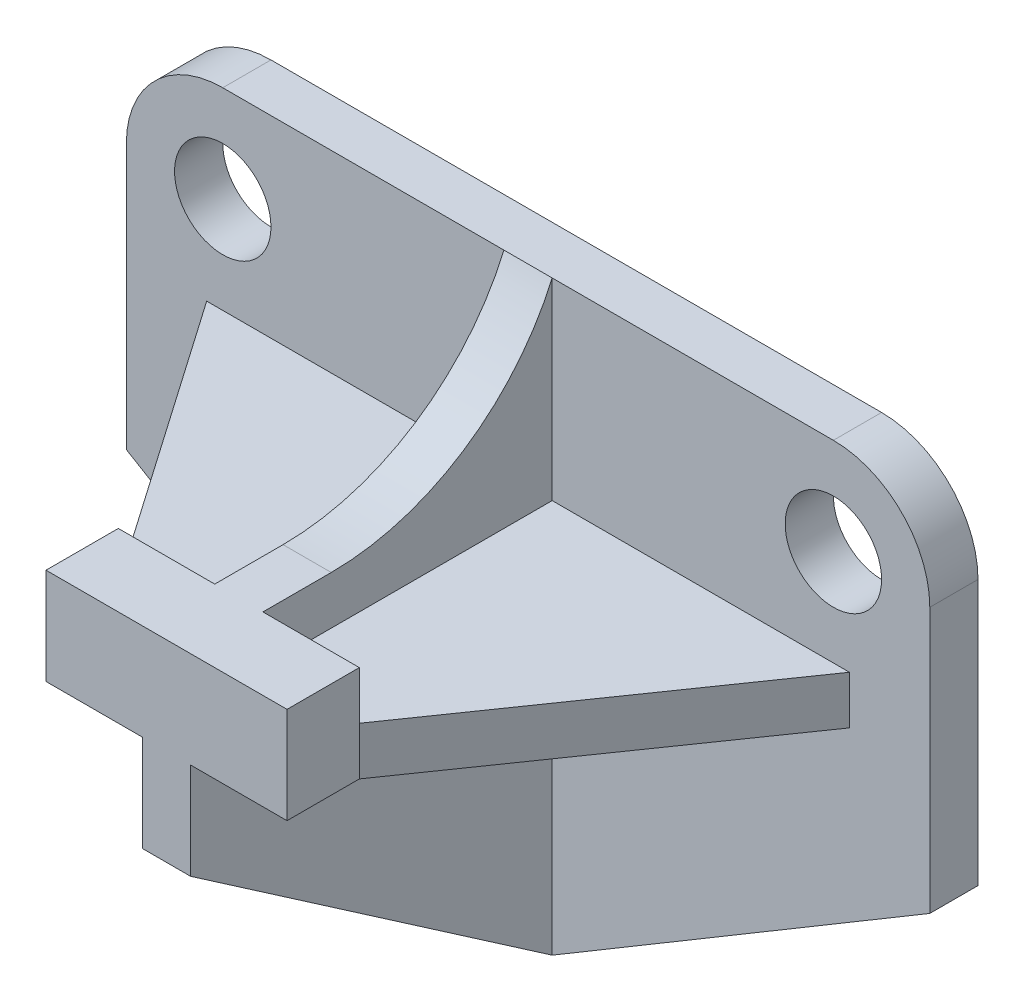
ISO-10303-21;
HEADER;
FILE_DESCRIPTION(('STEP AP214'),'2;1');
FILE_NAME('part.step','',(''),(''),'','','');
FILE_SCHEMA(('AUTOMOTIVE_DESIGN { 1 0 10303 214 1 1 1 1 }'));
ENDSEC;
DATA;
#1=APPLICATION_CONTEXT('core data for automotive mechanical design processes');
#2=APPLICATION_PROTOCOL_DEFINITION('international standard','automotive_design',2000,#1);
#3=PRODUCT_CONTEXT('',#1,'mechanical');
#4=PRODUCT('Part','Part','',(#3));
#5=PRODUCT_RELATED_PRODUCT_CATEGORY('part','',(#4));
#6=PRODUCT_DEFINITION_FORMATION('','',#4);
#7=PRODUCT_DEFINITION_CONTEXT('part definition',#1,'design');
#8=PRODUCT_DEFINITION('design','',#6,#7);
#9=PRODUCT_DEFINITION_SHAPE('','',#8);
#10=(LENGTH_UNIT() NAMED_UNIT(*) SI_UNIT(.MILLI.,.METRE.));
#11=(NAMED_UNIT(*) PLANE_ANGLE_UNIT() SI_UNIT($,.RADIAN.));
#12=(NAMED_UNIT(*) SI_UNIT($,.STERADIAN.) SOLID_ANGLE_UNIT());
#13=UNCERTAINTY_MEASURE_WITH_UNIT(LENGTH_MEASURE(1.E-05),#10,'distance_accuracy_value','');
#14=(GEOMETRIC_REPRESENTATION_CONTEXT(3) GLOBAL_UNCERTAINTY_ASSIGNED_CONTEXT((#13)) GLOBAL_UNIT_ASSIGNED_CONTEXT((#10,
#11,#12)) REPRESENTATION_CONTEXT('',''));
#15=CARTESIAN_POINT('',(0.,0.,0.));
#16=DIRECTION('',(0.,0.,1.));
#17=DIRECTION('',(1.,0.,0.));
#18=AXIS2_PLACEMENT_3D('',#15,#16,#17);
#19=CARTESIAN_POINT('',(0.,0.,6.));
#20=DIRECTION('',(0.,0.,1.));
#21=DIRECTION('',(1.,0.,0.));
#22=AXIS2_PLACEMENT_3D('',#19,#20,#21);
#23=PLANE('',#22);
#24=CARTESIAN_POINT('',(38.,24.5,6.));
#25=DIRECTION('',(0.,0.,1.));
#26=DIRECTION('',(1.,0.,0.));
#27=AXIS2_PLACEMENT_3D('',#24,#25,#26);
#28=CIRCLE('',#27,6.);
#29=CARTESIAN_POINT('',(44.,24.5,6.));
#30=VERTEX_POINT('',#29);
#31=EDGE_CURVE('E343',#30,#30,#28,.T.);
#32=ORIENTED_EDGE('',*,*,#31,.F.);
#33=EDGE_LOOP('',(#32));
#34=FACE_BOUND('',#33,.T.);
#35=DIRECTION('',(0.,1.,0.));
#36=VECTOR('',#35,1.);
#37=CARTESIAN_POINT('',(50.,36.5,6.));
#38=LINE('',#37,#36);
#39=CARTESIAN_POINT('',(50.,-8.49999999999999,6.));
#40=VERTEX_POINT('',#39);
#41=CARTESIAN_POINT('',(50.,24.5,6.));
#42=VERTEX_POINT('',#41);
#43=EDGE_CURVE('E225',#40,#42,#38,.T.);
#44=ORIENTED_EDGE('',*,*,#43,.T.);
#45=CARTESIAN_POINT('',(38.,24.5,6.));
#46=DIRECTION('',(0.,0.,1.));
#47=DIRECTION('',(1.,0.,0.));
#48=AXIS2_PLACEMENT_3D('',#45,#46,#47);
#49=CIRCLE('',#48,12.);
#50=CARTESIAN_POINT('',(38.,36.5,6.));
#51=VERTEX_POINT('',#50);
#52=EDGE_CURVE('E266',#42,#51,#49,.T.);
#53=ORIENTED_EDGE('',*,*,#52,.T.);
#54=DIRECTION('',(-1.,0.,0.));
#55=VECTOR('',#54,1.);
#56=CARTESIAN_POINT('',(-50.,36.5,6.));
#57=LINE('',#56,#55);
#58=CARTESIAN_POINT('',(3.,36.5,6.00000000000001));
#59=VERTEX_POINT('',#58);
#60=EDGE_CURVE('E224',#51,#59,#57,.T.);
#61=ORIENTED_EDGE('',*,*,#60,.T.);
#62=DIRECTION('',(0.,-1.,0.));
#63=VECTOR('',#62,1.);
#64=CARTESIAN_POINT('',(3.,0.,6.));
#65=LINE('',#64,#63);
#66=CARTESIAN_POINT('',(3.,12.5,6.));
#67=VERTEX_POINT('',#66);
#68=EDGE_CURVE('E357',#59,#67,#65,.T.);
#69=ORIENTED_EDGE('',*,*,#68,.T.);
#70=DIRECTION('',(1.,0.,0.));
#71=VECTOR('',#70,1.);
#72=CARTESIAN_POINT('',(-40.,12.5,6.));
#73=LINE('',#72,#71);
#74=CARTESIAN_POINT('',(40.,12.5,6.));
#75=VERTEX_POINT('',#74);
#76=EDGE_CURVE('E424',#67,#75,#73,.T.);
#77=ORIENTED_EDGE('',*,*,#76,.T.);
#78=DIRECTION('',(0.,-1.,0.));
#79=VECTOR('',#78,1.);
#80=CARTESIAN_POINT('',(40.,12.5,6.));
#81=LINE('',#80,#79);
#82=CARTESIAN_POINT('',(40.,6.50000000000001,6.));
#83=VERTEX_POINT('',#82);
#84=EDGE_CURVE('E439',#75,#83,#81,.T.);
#85=ORIENTED_EDGE('',*,*,#84,.T.);
#86=DIRECTION('',(1.,0.,0.));
#87=VECTOR('',#86,1.);
#88=CARTESIAN_POINT('',(-40.,6.5,6.));
#89=LINE('',#88,#87);
#90=CARTESIAN_POINT('',(3.,6.50000000000001,6.));
#91=VERTEX_POINT('',#90);
#92=EDGE_CURVE('E431',#91,#83,#89,.T.);
#93=ORIENTED_EDGE('',*,*,#92,.F.);
#94=DIRECTION('',(0.,-1.,0.));
#95=VECTOR('',#94,1.);
#96=CARTESIAN_POINT('',(3.,0.,6.));
#97=LINE('',#96,#95);
#98=CARTESIAN_POINT('',(3.,-36.5,6.));
#99=VERTEX_POINT('',#98);
#100=EDGE_CURVE('E299',#91,#99,#97,.T.);
#101=ORIENTED_EDGE('',*,*,#100,.T.);
#102=DIRECTION('',(0.859101543908756,0.511805175094578,0.));
#103=VECTOR('',#102,1.);
#104=CARTESIAN_POINT('',(3.,-36.5,6.));
#105=LINE('',#104,#103);
#106=EDGE_CURVE('E228',#99,#40,#105,.T.);
#107=ORIENTED_EDGE('',*,*,#106,.T.);
#108=EDGE_LOOP('',(#44,#53,#61,#69,#77,#85,#93,#101,#107));
#109=FACE_BOUND('',#108,.T.);
#110=ADVANCED_FACE('F33',(#34,#109),#23,.T.);
#111=CARTESIAN_POINT('',(0.,12.5,0.));
#112=DIRECTION('',(0.,1.,0.));
#113=DIRECTION('',(-1.,0.,0.));
#114=AXIS2_PLACEMENT_3D('',#111,#112,#113);
#115=PLANE('',#114);
#116=ORIENTED_EDGE('',*,*,#76,.F.);
#117=DIRECTION('',(0.,0.,1.));
#118=VECTOR('',#117,1.);
#119=CARTESIAN_POINT('',(3.,12.5,0.));
#120=LINE('',#119,#118);
#121=CARTESIAN_POINT('',(3.,12.5,42.));
#122=VERTEX_POINT('',#121);
#123=EDGE_CURVE('E354',#67,#122,#120,.T.);
#124=ORIENTED_EDGE('',*,*,#123,.T.);
#125=DIRECTION('',(-1.,0.,0.));
#126=VECTOR('',#125,1.);
#127=CARTESIAN_POINT('',(-15.,12.5,42.));
#128=LINE('',#127,#126);
#129=CARTESIAN_POINT('',(15.,12.5,42.));
#130=VERTEX_POINT('',#129);
#131=EDGE_CURVE('E417',#130,#122,#128,.T.);
#132=ORIENTED_EDGE('',*,*,#131,.F.);
#133=DIRECTION('',(-0.570395809495344,0.,0.821369965673296));
#134=VECTOR('',#133,1.);
#135=CARTESIAN_POINT('',(15.,12.5,42.));
#136=LINE('',#135,#134);
#137=EDGE_CURVE('E426',#75,#130,#136,.T.);
#138=ORIENTED_EDGE('',*,*,#137,.F.);
#139=EDGE_LOOP('',(#116,#124,#132,#138));
#140=FACE_BOUND('',#139,.T.);
#141=ADVANCED_FACE('F315',(#140),#115,.T.);
#142=CARTESIAN_POINT('',(0.,0.,42.));
#143=DIRECTION('',(0.,0.,1.));
#144=DIRECTION('',(1.,0.,0.));
#145=AXIS2_PLACEMENT_3D('',#142,#143,#144);
#146=PLANE('',#145);
#147=DIRECTION('',(0.,-1.,0.));
#148=VECTOR('',#147,1.);
#149=CARTESIAN_POINT('',(3.,0.,42.));
#150=LINE('',#149,#148);
#151=CARTESIAN_POINT('',(3.,18.5,42.));
#152=VERTEX_POINT('',#151);
#153=EDGE_CURVE('E352',#152,#122,#150,.T.);
#154=ORIENTED_EDGE('',*,*,#153,.F.);
#155=DIRECTION('',(-1.,0.,0.));
#156=VECTOR('',#155,1.);
#157=CARTESIAN_POINT('',(-15.,18.5,42.));
#158=LINE('',#157,#156);
#159=CARTESIAN_POINT('',(15.,18.5,42.));
#160=VERTEX_POINT('',#159);
#161=EDGE_CURVE('E393',#160,#152,#158,.T.);
#162=ORIENTED_EDGE('',*,*,#161,.F.);
#163=DIRECTION('',(0.,1.,0.));
#164=VECTOR('',#163,1.);
#165=CARTESIAN_POINT('',(15.,18.5,42.));
#166=LINE('',#165,#164);
#167=EDGE_CURVE('E389',#130,#160,#166,.T.);
#168=ORIENTED_EDGE('',*,*,#167,.F.);
#169=ORIENTED_EDGE('',*,*,#131,.T.);
#170=EDGE_LOOP('',(#154,#162,#168,#169));
#171=FACE_BOUND('',#170,.T.);
#172=ADVANCED_FACE('F321',(#171),#146,.F.);
#173=CARTESIAN_POINT('',(0.,6.50000000000001,0.));
#174=DIRECTION('',(0.,1.,0.));
#175=DIRECTION('',(-1.,0.,0.));
#176=AXIS2_PLACEMENT_3D('',#173,#174,#175);
#177=PLANE('',#176);
#178=DIRECTION('',(0.,0.,1.));
#179=VECTOR('',#178,1.);
#180=CARTESIAN_POINT('',(3.,6.50000000000001,0.));
#181=LINE('',#180,#179);
#182=CARTESIAN_POINT('',(3.,6.50000000000001,51.));
#183=VERTEX_POINT('',#182);
#184=EDGE_CURVE('E376',#91,#183,#181,.T.);
#185=ORIENTED_EDGE('',*,*,#184,.F.);
#186=ORIENTED_EDGE('',*,*,#92,.T.);
#187=DIRECTION('',(-0.570395809495344,0.,0.821369965673296));
#188=VECTOR('',#187,1.);
#189=CARTESIAN_POINT('',(15.,6.50000000000001,42.));
#190=LINE('',#189,#188);
#191=CARTESIAN_POINT('',(15.,6.50000000000001,42.));
#192=VERTEX_POINT('',#191);
#193=EDGE_CURVE('E435',#83,#192,#190,.T.);
#194=ORIENTED_EDGE('',*,*,#193,.T.);
#195=DIRECTION('',(0.,0.,1.));
#196=VECTOR('',#195,1.);
#197=CARTESIAN_POINT('',(15.,6.50000000000001,42.));
#198=LINE('',#197,#196);
#199=CARTESIAN_POINT('',(15.,6.50000000000001,51.));
#200=VERTEX_POINT('',#199);
#201=EDGE_CURVE('E413',#192,#200,#198,.T.);
#202=ORIENTED_EDGE('',*,*,#201,.T.);
#203=DIRECTION('',(1.,0.,0.));
#204=VECTOR('',#203,1.);
#205=CARTESIAN_POINT('',(-15.,6.50000000000001,51.));
#206=LINE('',#205,#204);
#207=EDGE_CURVE('E399',#183,#200,#206,.T.);
#208=ORIENTED_EDGE('',*,*,#207,.F.);
#209=EDGE_LOOP('',(#185,#186,#194,#202,#208));
#210=FACE_BOUND('',#209,.T.);
#211=ADVANCED_FACE('F480',(#210),#177,.F.);
#212=CARTESIAN_POINT('',(-50.,36.5,6.));
#213=DIRECTION('',(1.,0.,0.));
#214=DIRECTION('',(0.,1.,0.));
#215=AXIS2_PLACEMENT_3D('',#212,#213,#214);
#216=PLANE('',#215);
#217=DIRECTION('',(0.,-1.,0.));
#218=VECTOR('',#217,1.);
#219=CARTESIAN_POINT('',(-50.,36.5,6.));
#220=LINE('',#219,#218);
#221=CARTESIAN_POINT('',(-50.,24.5,6.));
#222=VERTEX_POINT('',#221);
#223=CARTESIAN_POINT('',(-50.,-8.49999999999999,6.));
#224=VERTEX_POINT('',#223);
#225=EDGE_CURVE('E245',#222,#224,#220,.T.);
#226=ORIENTED_EDGE('',*,*,#225,.F.);
#227=DIRECTION('',(0.,0.,-1.));
#228=VECTOR('',#227,1.);
#229=CARTESIAN_POINT('',(-50.,24.5,6.));
#230=LINE('',#229,#228);
#231=CARTESIAN_POINT('',(-50.,24.5,0.));
#232=VERTEX_POINT('',#231);
#233=EDGE_CURVE('E41',#222,#232,#230,.T.);
#234=ORIENTED_EDGE('',*,*,#233,.T.);
#235=DIRECTION('',(0.,-1.,0.));
#236=VECTOR('',#235,1.);
#237=CARTESIAN_POINT('',(-50.,36.5,0.));
#238=LINE('',#237,#236);
#239=CARTESIAN_POINT('',(-50.,-8.49999999999999,0.));
#240=VERTEX_POINT('',#239);
#241=EDGE_CURVE('E232',#232,#240,#238,.T.);
#242=ORIENTED_EDGE('',*,*,#241,.T.);
#243=DIRECTION('',(0.,0.,-1.));
#244=VECTOR('',#243,1.);
#245=CARTESIAN_POINT('',(-50.,-8.49999999999999,6.));
#246=LINE('',#245,#244);
#247=EDGE_CURVE('E254',#224,#240,#246,.T.);
#248=ORIENTED_EDGE('',*,*,#247,.F.);
#249=EDGE_LOOP('',(#226,#234,#242,#248));
#250=FACE_BOUND('',#249,.T.);
#251=ADVANCED_FACE('F271',(#250),#216,.F.);
#252=CARTESIAN_POINT('',(-3.,-36.5,6.));
#253=DIRECTION('',(0.511805175094578,0.859101543908756,0.));
#254=DIRECTION('',(-0.859101543908756,0.511805175094578,0.));
#255=AXIS2_PLACEMENT_3D('',#252,#253,#254);
#256=PLANE('',#255);
#257=DIRECTION('',(0.859101543908756,-0.511805175094578,0.));
#258=VECTOR('',#257,1.);
#259=CARTESIAN_POINT('',(-3.,-36.5,0.));
#260=LINE('',#259,#258);
#261=CARTESIAN_POINT('',(-3.,-36.5,0.));
#262=VERTEX_POINT('',#261);
#263=EDGE_CURVE('E234',#240,#262,#260,.T.);
#264=ORIENTED_EDGE('',*,*,#263,.T.);
#265=DIRECTION('',(0.,0.,-1.));
#266=VECTOR('',#265,1.);
#267=CARTESIAN_POINT('',(-3.,-36.5,6.));
#268=LINE('',#267,#266);
#269=CARTESIAN_POINT('',(-3.,-36.5,6.));
#270=VERTEX_POINT('',#269);
#271=EDGE_CURVE('E251',#270,#262,#268,.T.);
#272=ORIENTED_EDGE('',*,*,#271,.F.);
#273=DIRECTION('',(0.859101543908756,-0.511805175094578,0.));
#274=VECTOR('',#273,1.);
#275=CARTESIAN_POINT('',(-3.,-36.5,6.));
#276=LINE('',#275,#274);
#277=EDGE_CURVE('E285',#224,#270,#276,.T.);
#278=ORIENTED_EDGE('',*,*,#277,.F.);
#279=ORIENTED_EDGE('',*,*,#247,.T.);
#280=EDGE_LOOP('',(#264,#272,#278,#279));
#281=FACE_BOUND('',#280,.T.);
#282=ADVANCED_FACE('F283',(#281),#256,.F.);
#283=CARTESIAN_POINT('',(-3.,-36.5,6.));
#284=DIRECTION('',(0.,1.,0.));
#285=DIRECTION('',(0.,0.,1.));
#286=AXIS2_PLACEMENT_3D('',#283,#284,#285);
#287=PLANE('',#286);
#288=DIRECTION('',(1.,0.,0.));
#289=VECTOR('',#288,1.);
#290=CARTESIAN_POINT('',(-3.,-36.5,0.));
#291=LINE('',#290,#289);
#292=CARTESIAN_POINT('',(3.,-36.5,0.));
#293=VERTEX_POINT('',#292);
#294=EDGE_CURVE('E237',#262,#293,#291,.T.);
#295=ORIENTED_EDGE('',*,*,#294,.T.);
#296=DIRECTION('',(0.,0.,-1.));
#297=VECTOR('',#296,1.);
#298=CARTESIAN_POINT('',(3.,-36.5,6.));
#299=LINE('',#298,#297);
#300=EDGE_CURVE('E248',#99,#293,#299,.T.);
#301=ORIENTED_EDGE('',*,*,#300,.F.);
#302=DIRECTION('',(1.,0.,0.));
#303=VECTOR('',#302,1.);
#304=CARTESIAN_POINT('',(-3.,-36.5,6.));
#305=LINE('',#304,#303);
#306=EDGE_CURVE('E288',#270,#99,#305,.T.);
#307=ORIENTED_EDGE('',*,*,#306,.F.);
#308=ORIENTED_EDGE('',*,*,#271,.T.);
#309=EDGE_LOOP('',(#295,#301,#307,#308));
#310=FACE_BOUND('',#309,.T.);
#311=ADVANCED_FACE('F312',(#310),#287,.F.);
#312=CARTESIAN_POINT('',(3.,-36.5,6.));
#313=DIRECTION('',(-0.511805175094578,0.859101543908756,0.));
#314=DIRECTION('',(-0.859101543908756,-0.511805175094578,0.));
#315=AXIS2_PLACEMENT_3D('',#312,#313,#314);
#316=PLANE('',#315);
#317=DIRECTION('',(0.859101543908756,0.511805175094578,0.));
#318=VECTOR('',#317,1.);
#319=CARTESIAN_POINT('',(3.,-36.5,0.));
#320=LINE('',#319,#318);
#321=CARTESIAN_POINT('',(50.,-8.49999999999999,0.));
#322=VERTEX_POINT('',#321);
#323=EDGE_CURVE('E239',#293,#322,#320,.T.);
#324=ORIENTED_EDGE('',*,*,#323,.T.);
#325=DIRECTION('',(0.,0.,-1.));
#326=VECTOR('',#325,1.);
#327=CARTESIAN_POINT('',(50.,-8.49999999999999,6.));
#328=LINE('',#327,#326);
#329=EDGE_CURVE('E227',#40,#322,#328,.T.);
#330=ORIENTED_EDGE('',*,*,#329,.F.);
#331=ORIENTED_EDGE('',*,*,#106,.F.);
#332=ORIENTED_EDGE('',*,*,#300,.T.);
#333=EDGE_LOOP('',(#324,#330,#331,#332));
#334=FACE_BOUND('',#333,.T.);
#335=ADVANCED_FACE('F302',(#334),#316,.F.);
#336=CARTESIAN_POINT('',(50.,36.5,6.));
#337=DIRECTION('',(-1.,0.,0.));
#338=DIRECTION('',(0.,-1.,0.));
#339=AXIS2_PLACEMENT_3D('',#336,#337,#338);
#340=PLANE('',#339);
#341=DIRECTION('',(0.,1.,0.));
#342=VECTOR('',#341,1.);
#343=CARTESIAN_POINT('',(50.,36.5,0.));
#344=LINE('',#343,#342);
#345=CARTESIAN_POINT('',(50.,24.5,0.));
#346=VERTEX_POINT('',#345);
#347=EDGE_CURVE('E241',#322,#346,#344,.T.);
#348=ORIENTED_EDGE('',*,*,#347,.T.);
#349=DIRECTION('',(0.,0.,-1.));
#350=VECTOR('',#349,1.);
#351=CARTESIAN_POINT('',(50.,24.5,6.));
#352=LINE('',#351,#350);
#353=EDGE_CURVE('E54',#346,#42,#352,.F.);
#354=ORIENTED_EDGE('',*,*,#353,.T.);
#355=ORIENTED_EDGE('',*,*,#43,.F.);
#356=ORIENTED_EDGE('',*,*,#329,.T.);
#357=EDGE_LOOP('',(#348,#354,#355,#356));
#358=FACE_BOUND('',#357,.T.);
#359=ADVANCED_FACE('F304',(#358),#340,.F.);
#360=CARTESIAN_POINT('',(-50.,36.5,6.));
#361=DIRECTION('',(0.,-1.,0.));
#362=DIRECTION('',(0.,0.,-1.));
#363=AXIS2_PLACEMENT_3D('',#360,#361,#362);
#364=PLANE('',#363);
#365=ORIENTED_EDGE('',*,*,#60,.F.);
#366=DIRECTION('',(0.,0.,-1.));
#367=VECTOR('',#366,1.);
#368=CARTESIAN_POINT('',(38.,36.5,6.));
#369=LINE('',#368,#367);
#370=CARTESIAN_POINT('',(38.,36.5,0.));
#371=VERTEX_POINT('',#370);
#372=EDGE_CURVE('E258',#51,#371,#369,.T.);
#373=ORIENTED_EDGE('',*,*,#372,.T.);
#374=DIRECTION('',(-1.,0.,0.));
#375=VECTOR('',#374,1.);
#376=CARTESIAN_POINT('',(-50.,36.5,0.));
#377=LINE('',#376,#375);
#378=CARTESIAN_POINT('',(-38.,36.5,0.));
#379=VERTEX_POINT('',#378);
#380=EDGE_CURVE('E243',#371,#379,#377,.T.);
#381=ORIENTED_EDGE('',*,*,#380,.T.);
#382=DIRECTION('',(0.,0.,-1.));
#383=VECTOR('',#382,1.);
#384=CARTESIAN_POINT('',(-38.,36.5,6.));
#385=LINE('',#384,#383);
#386=CARTESIAN_POINT('',(-38.,36.5,6.));
#387=VERTEX_POINT('',#386);
#388=EDGE_CURVE('E223',#379,#387,#385,.F.);
#389=ORIENTED_EDGE('',*,*,#388,.T.);
#390=CARTESIAN_POINT('',(-3.,36.5,6.00000000000001));
#391=VERTEX_POINT('',#390);
#392=EDGE_CURVE('E214',#391,#387,#57,.T.);
#393=ORIENTED_EDGE('',*,*,#392,.F.);
#394=DIRECTION('',(-1.,0.,0.));
#395=VECTOR('',#394,1.);
#396=CARTESIAN_POINT('',(0.,36.5,6.00000000000001));
#397=LINE('',#396,#395);
#398=EDGE_CURVE('E190',#59,#391,#397,.T.);
#399=ORIENTED_EDGE('',*,*,#398,.F.);
#400=EDGE_LOOP('',(#365,#373,#381,#389,#393,#399));
#401=FACE_BOUND('',#400,.T.);
#402=ADVANCED_FACE('F220',(#401),#364,.F.);
#403=CARTESIAN_POINT('',(-38.,24.5,6.));
#404=DIRECTION('',(0.,0.,1.));
#405=DIRECTION('',(1.,0.,0.));
#406=AXIS2_PLACEMENT_3D('',#403,#404,#405);
#407=CIRCLE('',#406,6.00000000000001);
#408=CARTESIAN_POINT('',(-32.,24.5,6.));
#409=VERTEX_POINT('',#408);
#410=EDGE_CURVE('E337',#409,#409,#407,.T.);
#411=ORIENTED_EDGE('',*,*,#410,.F.);
#412=EDGE_LOOP('',(#411));
#413=FACE_BOUND('',#412,.T.);
#414=ORIENTED_EDGE('',*,*,#392,.T.);
#415=CARTESIAN_POINT('',(-38.,24.5,6.));
#416=DIRECTION('',(0.,0.,1.));
#417=DIRECTION('',(1.,0.,0.));
#418=AXIS2_PLACEMENT_3D('',#415,#416,#417);
#419=CIRCLE('',#418,12.);
#420=EDGE_CURVE('E11',#387,#222,#419,.T.);
#421=ORIENTED_EDGE('',*,*,#420,.T.);
#422=ORIENTED_EDGE('',*,*,#225,.T.);
#423=ORIENTED_EDGE('',*,*,#277,.T.);
#424=DIRECTION('',(0.,-1.,0.));
#425=VECTOR('',#424,1.);
#426=CARTESIAN_POINT('',(-3.,0.,6.));
#427=LINE('',#426,#425);
#428=CARTESIAN_POINT('',(-3.,6.50000000000001,6.));
#429=VERTEX_POINT('',#428);
#430=EDGE_CURVE('E381',#429,#270,#427,.T.);
#431=ORIENTED_EDGE('',*,*,#430,.F.);
#432=CARTESIAN_POINT('',(-40.,6.5,6.));
#433=VERTEX_POINT('',#432);
#434=EDGE_CURVE('E432',#433,#429,#89,.T.);
#435=ORIENTED_EDGE('',*,*,#434,.F.);
#436=DIRECTION('',(0.,-1.,0.));
#437=VECTOR('',#436,1.);
#438=CARTESIAN_POINT('',(-40.,12.5,6.));
#439=LINE('',#438,#437);
#440=CARTESIAN_POINT('',(-40.,12.5,6.));
#441=VERTEX_POINT('',#440);
#442=EDGE_CURVE('E442',#441,#433,#439,.T.);
#443=ORIENTED_EDGE('',*,*,#442,.F.);
#444=CARTESIAN_POINT('',(-3.,12.5,6.));
#445=VERTEX_POINT('',#444);
#446=EDGE_CURVE('E216',#441,#445,#73,.T.);
#447=ORIENTED_EDGE('',*,*,#446,.T.);
#448=DIRECTION('',(0.,-1.,0.));
#449=VECTOR('',#448,1.);
#450=CARTESIAN_POINT('',(-3.,0.,6.));
#451=LINE('',#450,#449);
#452=EDGE_CURVE('E206',#391,#445,#451,.T.);
#453=ORIENTED_EDGE('',*,*,#452,.F.);
#454=EDGE_LOOP('',(#414,#421,#422,#423,#431,#435,#443,#447,#453));
#455=FACE_BOUND('',#454,.T.);
#456=ADVANCED_FACE('F213',(#413,#455),#23,.T.);
#457=CARTESIAN_POINT('',(0.,0.,0.));
#458=DIRECTION('',(0.,0.,1.));
#459=DIRECTION('',(1.,0.,0.));
#460=AXIS2_PLACEMENT_3D('',#457,#458,#459);
#461=PLANE('',#460);
#462=CARTESIAN_POINT('',(38.,24.5,0.));
#463=DIRECTION('',(0.,0.,1.));
#464=DIRECTION('',(1.,0.,0.));
#465=AXIS2_PLACEMENT_3D('',#462,#463,#464);
#466=CIRCLE('',#465,6.);
#467=CARTESIAN_POINT('',(44.,24.5,0.));
#468=VERTEX_POINT('',#467);
#469=EDGE_CURVE('E346',#468,#468,#466,.T.);
#470=ORIENTED_EDGE('',*,*,#469,.T.);
#471=EDGE_LOOP('',(#470));
#472=FACE_BOUND('',#471,.T.);
#473=CARTESIAN_POINT('',(-38.,24.5,0.));
#474=DIRECTION('',(0.,0.,1.));
#475=DIRECTION('',(1.,0.,0.));
#476=AXIS2_PLACEMENT_3D('',#473,#474,#475);
#477=CIRCLE('',#476,6.00000000000001);
#478=CARTESIAN_POINT('',(-32.,24.5,0.));
#479=VERTEX_POINT('',#478);
#480=EDGE_CURVE('E339',#479,#479,#477,.T.);
#481=ORIENTED_EDGE('',*,*,#480,.T.);
#482=EDGE_LOOP('',(#481));
#483=FACE_BOUND('',#482,.T.);
#484=ORIENTED_EDGE('',*,*,#380,.F.);
#485=CARTESIAN_POINT('',(38.,24.5,0.));
#486=DIRECTION('',(0.,0.,1.));
#487=DIRECTION('',(1.,0.,0.));
#488=AXIS2_PLACEMENT_3D('',#485,#486,#487);
#489=CIRCLE('',#488,12.);
#490=EDGE_CURVE('E263',#371,#346,#489,.F.);
#491=ORIENTED_EDGE('',*,*,#490,.T.);
#492=ORIENTED_EDGE('',*,*,#347,.F.);
#493=ORIENTED_EDGE('',*,*,#323,.F.);
#494=ORIENTED_EDGE('',*,*,#294,.F.);
#495=ORIENTED_EDGE('',*,*,#263,.F.);
#496=ORIENTED_EDGE('',*,*,#241,.F.);
#497=CARTESIAN_POINT('',(-38.,24.5,0.));
#498=DIRECTION('',(0.,0.,1.));
#499=DIRECTION('',(1.,0.,0.));
#500=AXIS2_PLACEMENT_3D('',#497,#498,#499);
#501=CIRCLE('',#500,12.);
#502=EDGE_CURVE('E261',#232,#379,#501,.F.);
#503=ORIENTED_EDGE('',*,*,#502,.T.);
#504=EDGE_LOOP('',(#484,#491,#492,#493,#494,#495,#496,#503));
#505=FACE_BOUND('',#504,.T.);
#506=ADVANCED_FACE('F277',(#472,#483,#505),#461,.F.);
#507=CARTESIAN_POINT('',(15.,12.5,42.));
#508=DIRECTION('',(0.821369965673296,0.,0.570395809495344));
#509=DIRECTION('',(0.570395809495344,0.,-0.821369965673296));
#510=AXIS2_PLACEMENT_3D('',#507,#508,#509);
#511=PLANE('',#510);
#512=ORIENTED_EDGE('',*,*,#193,.F.);
#513=ORIENTED_EDGE('',*,*,#84,.F.);
#514=ORIENTED_EDGE('',*,*,#137,.T.);
#515=DIRECTION('',(0.,-1.,0.));
#516=VECTOR('',#515,1.);
#517=CARTESIAN_POINT('',(15.,12.5,42.));
#518=LINE('',#517,#516);
#519=EDGE_CURVE('E235',#130,#192,#518,.T.);
#520=ORIENTED_EDGE('',*,*,#519,.T.);
#521=EDGE_LOOP('',(#512,#513,#514,#520));
#522=FACE_BOUND('',#521,.T.);
#523=ADVANCED_FACE('F333',(#522),#511,.T.);
#524=CARTESIAN_POINT('',(-15.,12.5,42.));
#525=DIRECTION('',(-0.821369965673296,0.,0.570395809495344));
#526=DIRECTION('',(0.570395809495344,0.,0.821369965673296));
#527=AXIS2_PLACEMENT_3D('',#524,#525,#526);
#528=PLANE('',#527);
#529=DIRECTION('',(-0.570395809495344,0.,-0.821369965673296));
#530=VECTOR('',#529,1.);
#531=CARTESIAN_POINT('',(-15.,6.50000000000001,42.));
#532=LINE('',#531,#530);
#533=CARTESIAN_POINT('',(-15.,6.50000000000001,42.));
#534=VERTEX_POINT('',#533);
#535=EDGE_CURVE('E410',#534,#433,#532,.T.);
#536=ORIENTED_EDGE('',*,*,#535,.F.);
#537=DIRECTION('',(0.,-1.,0.));
#538=VECTOR('',#537,1.);
#539=CARTESIAN_POINT('',(-15.,12.5,42.));
#540=LINE('',#539,#538);
#541=CARTESIAN_POINT('',(-15.,12.5,42.));
#542=VERTEX_POINT('',#541);
#543=EDGE_CURVE('E429',#542,#534,#540,.T.);
#544=ORIENTED_EDGE('',*,*,#543,.F.);
#545=DIRECTION('',(-0.570395809495344,0.,-0.821369965673296));
#546=VECTOR('',#545,1.);
#547=CARTESIAN_POINT('',(-15.,12.5,42.));
#548=LINE('',#547,#546);
#549=EDGE_CURVE('E420',#542,#441,#548,.T.);
#550=ORIENTED_EDGE('',*,*,#549,.T.);
#551=ORIENTED_EDGE('',*,*,#442,.T.);
#552=EDGE_LOOP('',(#536,#544,#550,#551));
#553=FACE_BOUND('',#552,.T.);
#554=ADVANCED_FACE('F466',(#553),#528,.T.);
#555=DIRECTION('',(0.,0.,1.));
#556=VECTOR('',#555,1.);
#557=CARTESIAN_POINT('',(-3.,12.5,0.));
#558=LINE('',#557,#556);
#559=CARTESIAN_POINT('',(-3.,12.5,42.));
#560=VERTEX_POINT('',#559);
#561=EDGE_CURVE('E218',#445,#560,#558,.T.);
#562=ORIENTED_EDGE('',*,*,#561,.F.);
#563=ORIENTED_EDGE('',*,*,#446,.F.);
#564=ORIENTED_EDGE('',*,*,#549,.F.);
#565=EDGE_CURVE('E421',#560,#542,#128,.T.);
#566=ORIENTED_EDGE('',*,*,#565,.F.);
#567=EDGE_LOOP('',(#562,#563,#564,#566));
#568=FACE_BOUND('',#567,.T.);
#569=ADVANCED_FACE('F324',(#568),#115,.T.);
#570=ORIENTED_EDGE('',*,*,#434,.T.);
#571=DIRECTION('',(0.,0.,1.));
#572=VECTOR('',#571,1.);
#573=CARTESIAN_POINT('',(-3.,6.50000000000001,0.));
#574=LINE('',#573,#572);
#575=CARTESIAN_POINT('',(-3.,6.50000000000001,51.));
#576=VERTEX_POINT('',#575);
#577=EDGE_CURVE('E378',#429,#576,#574,.T.);
#578=ORIENTED_EDGE('',*,*,#577,.T.);
#579=CARTESIAN_POINT('',(-15.,6.50000000000001,51.));
#580=VERTEX_POINT('',#579);
#581=EDGE_CURVE('E400',#580,#576,#206,.T.);
#582=ORIENTED_EDGE('',*,*,#581,.F.);
#583=DIRECTION('',(0.,0.,1.));
#584=VECTOR('',#583,1.);
#585=CARTESIAN_POINT('',(-15.,6.50000000000001,42.));
#586=LINE('',#585,#584);
#587=EDGE_CURVE('E396',#534,#580,#586,.T.);
#588=ORIENTED_EDGE('',*,*,#587,.F.);
#589=ORIENTED_EDGE('',*,*,#535,.T.);
#590=EDGE_LOOP('',(#570,#578,#582,#588,#589));
#591=FACE_BOUND('',#590,.T.);
#592=ADVANCED_FACE('F455',(#591),#177,.F.);
#593=CARTESIAN_POINT('',(-3.,18.5,42.));
#594=VERTEX_POINT('',#593);
#595=CARTESIAN_POINT('',(-15.,18.5,42.));
#596=VERTEX_POINT('',#595);
#597=EDGE_CURVE('E392',#594,#596,#158,.T.);
#598=ORIENTED_EDGE('',*,*,#597,.F.);
#599=DIRECTION('',(0.,-1.,0.));
#600=VECTOR('',#599,1.);
#601=CARTESIAN_POINT('',(-3.,0.,42.));
#602=LINE('',#601,#600);
#603=EDGE_CURVE('E360',#594,#560,#602,.T.);
#604=ORIENTED_EDGE('',*,*,#603,.T.);
#605=ORIENTED_EDGE('',*,*,#565,.T.);
#606=DIRECTION('',(0.,-1.,0.));
#607=VECTOR('',#606,1.);
#608=CARTESIAN_POINT('',(-15.,18.5,42.));
#609=LINE('',#608,#607);
#610=EDGE_CURVE('E386',#596,#542,#609,.T.);
#611=ORIENTED_EDGE('',*,*,#610,.F.);
#612=EDGE_LOOP('',(#598,#604,#605,#611));
#613=FACE_BOUND('',#612,.T.);
#614=ADVANCED_FACE('F462',(#613),#146,.F.);
#615=CARTESIAN_POINT('',(-15.,18.5,42.));
#616=DIRECTION('',(-1.,0.,0.));
#617=DIRECTION('',(0.,0.,1.));
#618=AXIS2_PLACEMENT_3D('',#615,#616,#617);
#619=PLANE('',#618);
#620=DIRECTION('',(0.,-1.,0.));
#621=VECTOR('',#620,1.);
#622=CARTESIAN_POINT('',(-15.,18.5,51.));
#623=LINE('',#622,#621);
#624=CARTESIAN_POINT('',(-15.,18.5,51.));
#625=VERTEX_POINT('',#624);
#626=EDGE_CURVE('E383',#625,#580,#623,.T.);
#627=ORIENTED_EDGE('',*,*,#626,.F.);
#628=DIRECTION('',(0.,0.,1.));
#629=VECTOR('',#628,1.);
#630=CARTESIAN_POINT('',(-15.,18.5,42.));
#631=LINE('',#630,#629);
#632=EDGE_CURVE('E407',#596,#625,#631,.T.);
#633=ORIENTED_EDGE('',*,*,#632,.F.);
#634=ORIENTED_EDGE('',*,*,#610,.T.);
#635=ORIENTED_EDGE('',*,*,#543,.T.);
#636=ORIENTED_EDGE('',*,*,#587,.T.);
#637=EDGE_LOOP('',(#627,#633,#634,#635,#636));
#638=FACE_BOUND('',#637,.T.);
#639=ADVANCED_FACE('F449',(#638),#619,.T.);
#640=CARTESIAN_POINT('',(-15.,18.5,42.));
#641=DIRECTION('',(0.,1.,0.));
#642=DIRECTION('',(-1.,0.,0.));
#643=AXIS2_PLACEMENT_3D('',#640,#641,#642);
#644=PLANE('',#643);
#645=ORIENTED_EDGE('',*,*,#632,.T.);
#646=DIRECTION('',(-1.,0.,0.));
#647=VECTOR('',#646,1.);
#648=CARTESIAN_POINT('',(-15.,18.5,51.));
#649=LINE('',#648,#647);
#650=CARTESIAN_POINT('',(15.,18.5,51.));
#651=VERTEX_POINT('',#650);
#652=EDGE_CURVE('E390',#651,#625,#649,.T.);
#653=ORIENTED_EDGE('',*,*,#652,.F.);
#654=DIRECTION('',(0.,0.,1.));
#655=VECTOR('',#654,1.);
#656=CARTESIAN_POINT('',(15.,18.5,42.));
#657=LINE('',#656,#655);
#658=EDGE_CURVE('E411',#160,#651,#657,.T.);
#659=ORIENTED_EDGE('',*,*,#658,.F.);
#660=ORIENTED_EDGE('',*,*,#161,.T.);
#661=DIRECTION('',(0.,0.,1.));
#662=VECTOR('',#661,1.);
#663=CARTESIAN_POINT('',(3.,18.5,25.5));
#664=LINE('',#663,#662);
#665=CARTESIAN_POINT('',(3.,18.5,33.495454169735));
#666=VERTEX_POINT('',#665);
#667=EDGE_CURVE('E210',#152,#666,#664,.F.);
#668=ORIENTED_EDGE('',*,*,#667,.T.);
#669=DIRECTION('',(-1.,0.,0.));
#670=VECTOR('',#669,1.);
#671=CARTESIAN_POINT('',(0.,18.5,33.495454169735));
#672=LINE('',#671,#670);
#673=CARTESIAN_POINT('',(-3.,18.5,33.495454169735));
#674=VERTEX_POINT('',#673);
#675=EDGE_CURVE('E200',#666,#674,#672,.T.);
#676=ORIENTED_EDGE('',*,*,#675,.T.);
#677=DIRECTION('',(0.,0.,1.));
#678=VECTOR('',#677,1.);
#679=CARTESIAN_POINT('',(-3.,18.5,25.5));
#680=LINE('',#679,#678);
#681=EDGE_CURVE('E201',#594,#674,#680,.F.);
#682=ORIENTED_EDGE('',*,*,#681,.F.);
#683=ORIENTED_EDGE('',*,*,#597,.T.);
#684=EDGE_LOOP('',(#645,#653,#659,#660,#668,#676,#682,#683));
#685=FACE_BOUND('',#684,.T.);
#686=ADVANCED_FACE('F488',(#685),#644,.T.);
#687=CARTESIAN_POINT('',(15.,18.5,42.));
#688=DIRECTION('',(1.,0.,0.));
#689=DIRECTION('',(0.,0.,-1.));
#690=AXIS2_PLACEMENT_3D('',#687,#688,#689);
#691=PLANE('',#690);
#692=DIRECTION('',(0.,1.,0.));
#693=VECTOR('',#692,1.);
#694=CARTESIAN_POINT('',(15.,18.5,51.));
#695=LINE('',#694,#693);
#696=EDGE_CURVE('E403',#200,#651,#695,.T.);
#697=ORIENTED_EDGE('',*,*,#696,.F.);
#698=ORIENTED_EDGE('',*,*,#201,.F.);
#699=ORIENTED_EDGE('',*,*,#519,.F.);
#700=ORIENTED_EDGE('',*,*,#167,.T.);
#701=ORIENTED_EDGE('',*,*,#658,.T.);
#702=EDGE_LOOP('',(#697,#698,#699,#700,#701));
#703=FACE_BOUND('',#702,.T.);
#704=ADVANCED_FACE('F486',(#703),#691,.T.);
#705=CARTESIAN_POINT('',(0.,0.,51.));
#706=DIRECTION('',(0.,0.,1.));
#707=DIRECTION('',(1.,0.,0.));
#708=AXIS2_PLACEMENT_3D('',#705,#706,#707);
#709=PLANE('',#708);
#710=ORIENTED_EDGE('',*,*,#581,.T.);
#711=DIRECTION('',(0.,1.,0.));
#712=VECTOR('',#711,1.);
#713=CARTESIAN_POINT('',(-3.,0.,51.));
#714=LINE('',#713,#712);
#715=CARTESIAN_POINT('',(-3.,-5.49999999999999,51.));
#716=VERTEX_POINT('',#715);
#717=EDGE_CURVE('E364',#576,#716,#714,.F.);
#718=ORIENTED_EDGE('',*,*,#717,.T.);
#719=DIRECTION('',(-1.,0.,0.));
#720=VECTOR('',#719,1.);
#721=CARTESIAN_POINT('',(0.,-5.49999999999999,51.));
#722=LINE('',#721,#720);
#723=CARTESIAN_POINT('',(3.,-5.49999999999999,51.));
#724=VERTEX_POINT('',#723);
#725=EDGE_CURVE('E366',#724,#716,#722,.T.);
#726=ORIENTED_EDGE('',*,*,#725,.F.);
#727=DIRECTION('',(0.,1.,0.));
#728=VECTOR('',#727,1.);
#729=CARTESIAN_POINT('',(3.,0.,51.));
#730=LINE('',#729,#728);
#731=EDGE_CURVE('E370',#183,#724,#730,.F.);
#732=ORIENTED_EDGE('',*,*,#731,.F.);
#733=ORIENTED_EDGE('',*,*,#207,.T.);
#734=ORIENTED_EDGE('',*,*,#696,.T.);
#735=ORIENTED_EDGE('',*,*,#652,.T.);
#736=ORIENTED_EDGE('',*,*,#626,.T.);
#737=EDGE_LOOP('',(#710,#718,#726,#732,#733,#734,#735,#736));
#738=FACE_BOUND('',#737,.T.);
#739=ADVANCED_FACE('F457',(#738),#709,.T.);
#740=CARTESIAN_POINT('',(0.,-5.49999999999999,51.));
#741=DIRECTION('',(0.,0.823507601010236,-0.567305236251496));
#742=DIRECTION('',(0.,-0.567305236251496,-0.823507601010236));
#743=AXIS2_PLACEMENT_3D('',#740,#741,#742);
#744=PLANE('',#743);
#745=DIRECTION('',(0.,-0.567305236251496,-0.823507601010236));
#746=VECTOR('',#745,1.);
#747=CARTESIAN_POINT('',(-3.,-5.49999999999999,51.));
#748=LINE('',#747,#746);
#749=EDGE_CURVE('E367',#716,#270,#748,.T.);
#750=ORIENTED_EDGE('',*,*,#749,.T.);
#751=ORIENTED_EDGE('',*,*,#306,.T.);
#752=DIRECTION('',(0.,-0.567305236251496,-0.823507601010236));
#753=VECTOR('',#752,1.);
#754=CARTESIAN_POINT('',(3.,-5.49999999999999,51.));
#755=LINE('',#754,#753);
#756=EDGE_CURVE('E217',#724,#99,#755,.T.);
#757=ORIENTED_EDGE('',*,*,#756,.F.);
#758=ORIENTED_EDGE('',*,*,#725,.T.);
#759=EDGE_LOOP('',(#750,#751,#757,#758));
#760=FACE_BOUND('',#759,.T.);
#761=ADVANCED_FACE('F472',(#760),#744,.F.);
#762=CARTESIAN_POINT('',(-3.,0.,25.5));
#763=DIRECTION('',(-1.,0.,0.));
#764=DIRECTION('',(0.,0.,1.));
#765=AXIS2_PLACEMENT_3D('',#762,#763,#764);
#766=PLANE('',#765);
#767=ORIENTED_EDGE('',*,*,#577,.F.);
#768=ORIENTED_EDGE('',*,*,#430,.T.);
#769=ORIENTED_EDGE('',*,*,#749,.F.);
#770=ORIENTED_EDGE('',*,*,#717,.F.);
#771=EDGE_LOOP('',(#767,#768,#769,#770));
#772=FACE_BOUND('',#771,.T.);
#773=ADVANCED_FACE('F470',(#772),#766,.T.);
#774=CARTESIAN_POINT('',(3.,0.,25.5));
#775=DIRECTION('',(-1.,0.,0.));
#776=DIRECTION('',(0.,0.,1.));
#777=AXIS2_PLACEMENT_3D('',#774,#775,#776);
#778=PLANE('',#777);
#779=ORIENTED_EDGE('',*,*,#100,.F.);
#780=ORIENTED_EDGE('',*,*,#184,.T.);
#781=ORIENTED_EDGE('',*,*,#731,.T.);
#782=ORIENTED_EDGE('',*,*,#756,.T.);
#783=EDGE_LOOP('',(#779,#780,#781,#782));
#784=FACE_BOUND('',#783,.T.);
#785=ADVANCED_FACE('F478',(#784),#778,.F.);
#786=CARTESIAN_POINT('',(3.,0.,25.5));
#787=DIRECTION('',(-1.,0.,0.));
#788=DIRECTION('',(0.,0.,1.));
#789=AXIS2_PLACEMENT_3D('',#786,#787,#788);
#790=PLANE('',#789);
#791=ORIENTED_EDGE('',*,*,#68,.F.);
#792=CARTESIAN_POINT('',(3.,48.5,33.495454169735));
#793=DIRECTION('',(1.,0.,0.));
#794=DIRECTION('',(0.,0.,-1.));
#795=AXIS2_PLACEMENT_3D('',#792,#793,#794);
#796=CIRCLE('',#795,30.);
#797=EDGE_CURVE('E196',#666,#59,#796,.T.);
#798=ORIENTED_EDGE('',*,*,#797,.F.);
#799=ORIENTED_EDGE('',*,*,#667,.F.);
#800=ORIENTED_EDGE('',*,*,#153,.T.);
#801=ORIENTED_EDGE('',*,*,#123,.F.);
#802=EDGE_LOOP('',(#791,#798,#799,#800,#801));
#803=FACE_BOUND('',#802,.T.);
#804=ADVANCED_FACE('F495',(#803),#790,.F.);
#805=CARTESIAN_POINT('',(0.,48.5,33.495454169735));
#806=DIRECTION('',(1.,0.,0.));
#807=DIRECTION('',(0.,0.,-1.));
#808=AXIS2_PLACEMENT_3D('',#805,#806,#807);
#809=CYLINDRICAL_SURFACE('',#808,30.);
#810=ORIENTED_EDGE('',*,*,#675,.F.);
#811=ORIENTED_EDGE('',*,*,#797,.T.);
#812=ORIENTED_EDGE('',*,*,#398,.T.);
#813=CARTESIAN_POINT('',(-3.,48.5,33.495454169735));
#814=DIRECTION('',(1.,0.,0.));
#815=DIRECTION('',(0.,0.,-1.));
#816=AXIS2_PLACEMENT_3D('',#813,#814,#815);
#817=CIRCLE('',#816,30.);
#818=EDGE_CURVE('E194',#674,#391,#817,.T.);
#819=ORIENTED_EDGE('',*,*,#818,.F.);
#820=EDGE_LOOP('',(#810,#811,#812,#819));
#821=FACE_BOUND('',#820,.T.);
#822=ADVANCED_FACE('F193',(#821),#809,.F.);
#823=CARTESIAN_POINT('',(-3.,0.,25.5));
#824=DIRECTION('',(-1.,0.,0.));
#825=DIRECTION('',(0.,0.,1.));
#826=AXIS2_PLACEMENT_3D('',#823,#824,#825);
#827=PLANE('',#826);
#828=ORIENTED_EDGE('',*,*,#818,.T.);
#829=ORIENTED_EDGE('',*,*,#452,.T.);
#830=ORIENTED_EDGE('',*,*,#561,.T.);
#831=ORIENTED_EDGE('',*,*,#603,.F.);
#832=ORIENTED_EDGE('',*,*,#681,.T.);
#833=EDGE_LOOP('',(#828,#829,#830,#831,#832));
#834=FACE_BOUND('',#833,.T.);
#835=ADVANCED_FACE('F205',(#834),#827,.T.);
#836=CARTESIAN_POINT('',(-38.,24.5,6.));
#837=DIRECTION('',(0.,0.,-1.));
#838=DIRECTION('',(-1.,0.,0.));
#839=AXIS2_PLACEMENT_3D('',#836,#837,#838);
#840=CYLINDRICAL_SURFACE('',#839,6.00000000000001);
#841=ORIENTED_EDGE('',*,*,#410,.T.);
#842=EDGE_LOOP('',(#841));
#843=FACE_BOUND('',#842,.T.);
#844=ORIENTED_EDGE('',*,*,#480,.F.);
#845=EDGE_LOOP('',(#844));
#846=FACE_BOUND('',#845,.T.);
#847=ADVANCED_FACE('F531',(#843,#846),#840,.F.);
#848=CARTESIAN_POINT('',(38.,24.5,6.));
#849=DIRECTION('',(0.,0.,-1.));
#850=DIRECTION('',(-1.,0.,0.));
#851=AXIS2_PLACEMENT_3D('',#848,#849,#850);
#852=CYLINDRICAL_SURFACE('',#851,6.);
#853=ORIENTED_EDGE('',*,*,#31,.T.);
#854=EDGE_LOOP('',(#853));
#855=FACE_BOUND('',#854,.T.);
#856=ORIENTED_EDGE('',*,*,#469,.F.);
#857=EDGE_LOOP('',(#856));
#858=FACE_BOUND('',#857,.T.);
#859=ADVANCED_FACE('F534',(#855,#858),#852,.F.);
#860=CARTESIAN_POINT('',(38.,24.5,6.));
#861=DIRECTION('',(0.,0.,-1.));
#862=DIRECTION('',(-1.,0.,0.));
#863=AXIS2_PLACEMENT_3D('',#860,#861,#862);
#864=CYLINDRICAL_SURFACE('',#863,12.);
#865=ORIENTED_EDGE('',*,*,#52,.F.);
#866=ORIENTED_EDGE('',*,*,#353,.F.);
#867=ORIENTED_EDGE('',*,*,#490,.F.);
#868=ORIENTED_EDGE('',*,*,#372,.F.);
#869=EDGE_LOOP('',(#865,#866,#867,#868));
#870=FACE_BOUND('',#869,.T.);
#871=ADVANCED_FACE('F536',(#870),#864,.T.);
#872=CARTESIAN_POINT('',(-38.,24.5,6.));
#873=DIRECTION('',(0.,0.,-1.));
#874=DIRECTION('',(-1.,0.,0.));
#875=AXIS2_PLACEMENT_3D('',#872,#873,#874);
#876=CYLINDRICAL_SURFACE('',#875,12.);
#877=ORIENTED_EDGE('',*,*,#420,.F.);
#878=ORIENTED_EDGE('',*,*,#388,.F.);
#879=ORIENTED_EDGE('',*,*,#502,.F.);
#880=ORIENTED_EDGE('',*,*,#233,.F.);
#881=EDGE_LOOP('',(#877,#878,#879,#880));
#882=FACE_BOUND('',#881,.T.);
#883=ADVANCED_FACE('F35',(#882),#876,.T.);
#884=CLOSED_SHELL('',(#110,#141,#172,#211,#251,#282,#311,#335,#359,#402,#456,#506,#523,#554,
#569,#592,#614,#639,#686,#704,#739,#761,#773,#785,#804,#822,#835,#847,#859,#871,#883));
#885=MANIFOLD_SOLID_BREP('B2',#884);
#886=ADVANCED_BREP_SHAPE_REPRESENTATION('',(#18,#885),#14);
#887=SHAPE_DEFINITION_REPRESENTATION(#9,#886);
ENDSEC;
END-ISO-10303-21;
